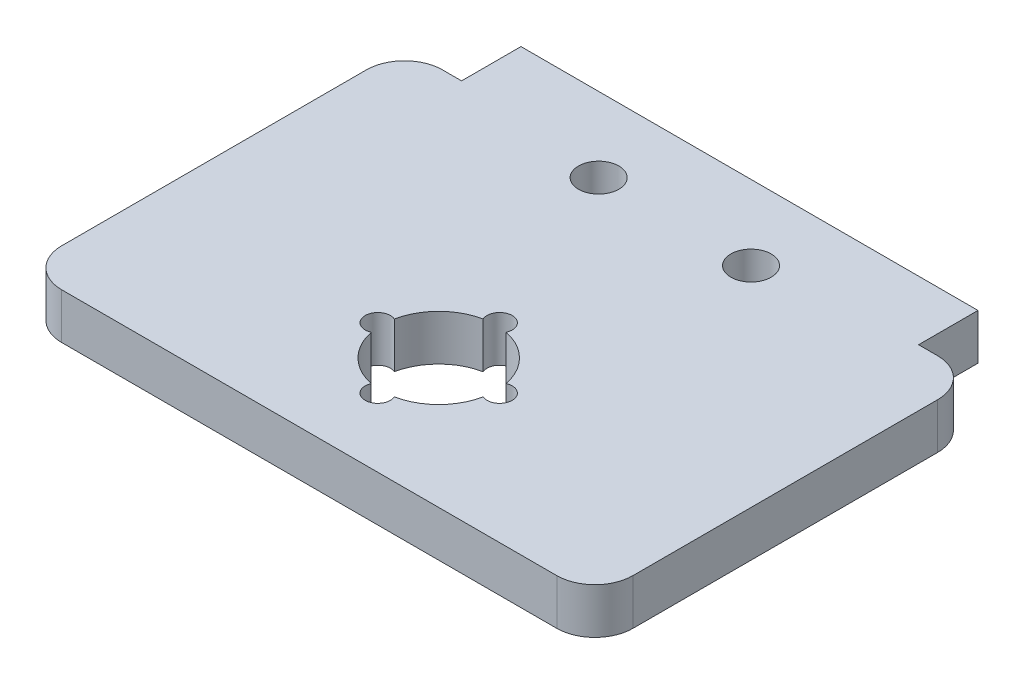
ISO-10303-21;
HEADER;
FILE_DESCRIPTION(('STEP AP214'),'2;1');
FILE_NAME('part.step','',(''),(''),'','','');
FILE_SCHEMA(('AUTOMOTIVE_DESIGN { 1 0 10303 214 1 1 1 1 }'));
ENDSEC;
DATA;
#1=APPLICATION_CONTEXT('core data for automotive mechanical design processes');
#2=APPLICATION_PROTOCOL_DEFINITION('international standard','automotive_design',2000,#1);
#3=PRODUCT_CONTEXT('',#1,'mechanical');
#4=PRODUCT('Part','Part','',(#3));
#5=PRODUCT_RELATED_PRODUCT_CATEGORY('part','',(#4));
#6=PRODUCT_DEFINITION_FORMATION('','',#4);
#7=PRODUCT_DEFINITION_CONTEXT('part definition',#1,'design');
#8=PRODUCT_DEFINITION('design','',#6,#7);
#9=PRODUCT_DEFINITION_SHAPE('','',#8);
#10=(LENGTH_UNIT() NAMED_UNIT(*) SI_UNIT(.MILLI.,.METRE.));
#11=(NAMED_UNIT(*) PLANE_ANGLE_UNIT() SI_UNIT($,.RADIAN.));
#12=(NAMED_UNIT(*) SI_UNIT($,.STERADIAN.) SOLID_ANGLE_UNIT());
#13=UNCERTAINTY_MEASURE_WITH_UNIT(LENGTH_MEASURE(1.E-05),#10,'distance_accuracy_value','');
#14=(GEOMETRIC_REPRESENTATION_CONTEXT(3) GLOBAL_UNCERTAINTY_ASSIGNED_CONTEXT((#13)) GLOBAL_UNIT_ASSIGNED_CONTEXT((#10,
#11,#12)) REPRESENTATION_CONTEXT('',''));
#15=CARTESIAN_POINT('',(0.,0.,0.));
#16=DIRECTION('',(0.,0.,1.));
#17=DIRECTION('',(1.,0.,0.));
#18=AXIS2_PLACEMENT_3D('',#15,#16,#17);
#19=CARTESIAN_POINT('',(-8.,6.,0.));
#20=DIRECTION('',(0.,-1.,0.));
#21=DIRECTION('',(0.,0.,-1.));
#22=AXIS2_PLACEMENT_3D('',#19,#20,#21);
#23=CYLINDRICAL_SURFACE('',#22,1.65);
#24=CARTESIAN_POINT('',(-8.,0.,0.));
#25=DIRECTION('',(0.,1.,0.));
#26=DIRECTION('',(0.,0.,1.));
#27=AXIS2_PLACEMENT_3D('',#24,#25,#26);
#28=CIRCLE('',#27,1.65);
#29=CARTESIAN_POINT('',(-7.34546875,0.,-1.51462498420349));
#30=VERTEX_POINT('',#29);
#31=CARTESIAN_POINT('',(-7.34546875,0.,1.51462498420349));
#32=VERTEX_POINT('',#31);
#33=EDGE_CURVE('E247',#30,#32,#28,.T.);
#34=ORIENTED_EDGE('',*,*,#33,.F.);
#35=DIRECTION('',(0.,-1.,0.));
#36=VECTOR('',#35,1.);
#37=CARTESIAN_POINT('',(-7.34546875,6.,-1.51462498420349));
#38=LINE('',#37,#36);
#39=CARTESIAN_POINT('',(-7.34546875,6.,-1.51462498420349));
#40=VERTEX_POINT('',#39);
#41=EDGE_CURVE('E45',#40,#30,#38,.T.);
#42=ORIENTED_EDGE('',*,*,#41,.F.);
#43=CARTESIAN_POINT('',(-8.,6.,0.));
#44=DIRECTION('',(0.,1.,0.));
#45=DIRECTION('',(0.,0.,1.));
#46=AXIS2_PLACEMENT_3D('',#43,#44,#45);
#47=CIRCLE('',#46,1.65);
#48=CARTESIAN_POINT('',(-7.34546875,6.,1.51462498420349));
#49=VERTEX_POINT('',#48);
#50=EDGE_CURVE('E347',#40,#49,#47,.T.);
#51=ORIENTED_EDGE('',*,*,#50,.T.);
#52=DIRECTION('',(0.,-1.,0.));
#53=VECTOR('',#52,1.);
#54=CARTESIAN_POINT('',(-7.34546875,6.,1.51462498420349));
#55=LINE('',#54,#53);
#56=EDGE_CURVE('E60',#49,#32,#55,.T.);
#57=ORIENTED_EDGE('',*,*,#56,.T.);
#58=EDGE_LOOP('',(#34,#42,#51,#57));
#59=FACE_BOUND('',#58,.T.);
#60=ADVANCED_FACE('F37',(#59),#23,.F.);
#61=CARTESIAN_POINT('',(0.,6.,0.));
#62=DIRECTION('',(0.,-1.,0.));
#63=DIRECTION('',(0.,0.,-1.));
#64=AXIS2_PLACEMENT_3D('',#61,#62,#63);
#65=CYLINDRICAL_SURFACE('',#64,7.5);
#66=CARTESIAN_POINT('',(0.,0.,0.));
#67=DIRECTION('',(0.,1.,0.));
#68=DIRECTION('',(0.,0.,1.));
#69=AXIS2_PLACEMENT_3D('',#66,#67,#68);
#70=CIRCLE('',#69,7.5);
#71=CARTESIAN_POINT('',(-1.51462498420349,0.,-7.34546875));
#72=VERTEX_POINT('',#71);
#73=EDGE_CURVE('E249',#72,#30,#70,.T.);
#74=ORIENTED_EDGE('',*,*,#73,.F.);
#75=DIRECTION('',(0.,-1.,0.));
#76=VECTOR('',#75,1.);
#77=CARTESIAN_POINT('',(-1.51462498420349,6.,-7.34546875));
#78=LINE('',#77,#76);
#79=CARTESIAN_POINT('',(-1.51462498420349,6.,-7.34546875));
#80=VERTEX_POINT('',#79);
#81=EDGE_CURVE('E274',#80,#72,#78,.T.);
#82=ORIENTED_EDGE('',*,*,#81,.F.);
#83=CARTESIAN_POINT('',(0.,6.,0.));
#84=DIRECTION('',(0.,1.,0.));
#85=DIRECTION('',(0.,0.,1.));
#86=AXIS2_PLACEMENT_3D('',#83,#84,#85);
#87=CIRCLE('',#86,7.5);
#88=EDGE_CURVE('E208',#80,#40,#87,.T.);
#89=ORIENTED_EDGE('',*,*,#88,.T.);
#90=ORIENTED_EDGE('',*,*,#41,.T.);
#91=EDGE_LOOP('',(#74,#82,#89,#90));
#92=FACE_BOUND('',#91,.T.);
#93=ADVANCED_FACE('F367',(#92),#65,.F.);
#94=CARTESIAN_POINT('',(0.,6.,-8.));
#95=DIRECTION('',(0.,-1.,0.));
#96=DIRECTION('',(0.,0.,-1.));
#97=AXIS2_PLACEMENT_3D('',#94,#95,#96);
#98=CYLINDRICAL_SURFACE('',#97,1.65);
#99=CARTESIAN_POINT('',(0.,0.,-8.));
#100=DIRECTION('',(0.,1.,0.));
#101=DIRECTION('',(0.,0.,1.));
#102=AXIS2_PLACEMENT_3D('',#99,#100,#101);
#103=CIRCLE('',#102,1.65);
#104=CARTESIAN_POINT('',(1.51462498420349,0.,-7.34546875));
#105=VERTEX_POINT('',#104);
#106=EDGE_CURVE('E252',#105,#72,#103,.T.);
#107=ORIENTED_EDGE('',*,*,#106,.F.);
#108=DIRECTION('',(0.,-1.,0.));
#109=VECTOR('',#108,1.);
#110=CARTESIAN_POINT('',(1.51462498420349,6.,-7.34546875));
#111=LINE('',#110,#109);
#112=CARTESIAN_POINT('',(1.51462498420349,6.,-7.34546875));
#113=VERTEX_POINT('',#112);
#114=EDGE_CURVE('E272',#113,#105,#111,.T.);
#115=ORIENTED_EDGE('',*,*,#114,.F.);
#116=CARTESIAN_POINT('',(0.,6.,-8.));
#117=DIRECTION('',(0.,1.,0.));
#118=DIRECTION('',(0.,0.,1.));
#119=AXIS2_PLACEMENT_3D('',#116,#117,#118);
#120=CIRCLE('',#119,1.65);
#121=EDGE_CURVE('E349',#113,#80,#120,.T.);
#122=ORIENTED_EDGE('',*,*,#121,.T.);
#123=ORIENTED_EDGE('',*,*,#81,.T.);
#124=EDGE_LOOP('',(#107,#115,#122,#123));
#125=FACE_BOUND('',#124,.T.);
#126=ADVANCED_FACE('F369',(#125),#98,.F.);
#127=CARTESIAN_POINT('',(7.34546875,0.,-1.5146249842035));
#128=VERTEX_POINT('',#127);
#129=EDGE_CURVE('E254',#128,#105,#70,.T.);
#130=ORIENTED_EDGE('',*,*,#129,.F.);
#131=DIRECTION('',(0.,-1.,0.));
#132=VECTOR('',#131,1.);
#133=CARTESIAN_POINT('',(7.34546875,6.,-1.5146249842035));
#134=LINE('',#133,#132);
#135=CARTESIAN_POINT('',(7.34546875,6.,-1.5146249842035));
#136=VERTEX_POINT('',#135);
#137=EDGE_CURVE('E270',#136,#128,#134,.T.);
#138=ORIENTED_EDGE('',*,*,#137,.F.);
#139=EDGE_CURVE('E203',#136,#113,#87,.T.);
#140=ORIENTED_EDGE('',*,*,#139,.T.);
#141=ORIENTED_EDGE('',*,*,#114,.T.);
#142=EDGE_LOOP('',(#130,#138,#140,#141));
#143=FACE_BOUND('',#142,.T.);
#144=ADVANCED_FACE('F370',(#143),#65,.F.);
#145=CARTESIAN_POINT('',(8.,6.,0.));
#146=DIRECTION('',(0.,-1.,0.));
#147=DIRECTION('',(0.,0.,-1.));
#148=AXIS2_PLACEMENT_3D('',#145,#146,#147);
#149=CYLINDRICAL_SURFACE('',#148,1.65);
#150=CARTESIAN_POINT('',(8.,0.,0.));
#151=DIRECTION('',(0.,1.,0.));
#152=DIRECTION('',(0.,0.,1.));
#153=AXIS2_PLACEMENT_3D('',#150,#151,#152);
#154=CIRCLE('',#153,1.65);
#155=CARTESIAN_POINT('',(7.34546875,0.,1.5146249842035));
#156=VERTEX_POINT('',#155);
#157=EDGE_CURVE('E257',#156,#128,#154,.T.);
#158=ORIENTED_EDGE('',*,*,#157,.F.);
#159=DIRECTION('',(0.,-1.,0.));
#160=VECTOR('',#159,1.);
#161=CARTESIAN_POINT('',(7.34546875,6.,1.5146249842035));
#162=LINE('',#161,#160);
#163=CARTESIAN_POINT('',(7.34546875,6.,1.5146249842035));
#164=VERTEX_POINT('',#163);
#165=EDGE_CURVE('E188',#164,#156,#162,.T.);
#166=ORIENTED_EDGE('',*,*,#165,.F.);
#167=CARTESIAN_POINT('',(8.,6.,0.));
#168=DIRECTION('',(0.,1.,0.));
#169=DIRECTION('',(0.,0.,1.));
#170=AXIS2_PLACEMENT_3D('',#167,#168,#169);
#171=CIRCLE('',#170,1.65);
#172=EDGE_CURVE('E201',#164,#136,#171,.T.);
#173=ORIENTED_EDGE('',*,*,#172,.T.);
#174=ORIENTED_EDGE('',*,*,#137,.T.);
#175=EDGE_LOOP('',(#158,#166,#173,#174));
#176=FACE_BOUND('',#175,.T.);
#177=ADVANCED_FACE('F357',(#176),#149,.F.);
#178=CARTESIAN_POINT('',(1.5146249842035,0.,7.34546875));
#179=VERTEX_POINT('',#178);
#180=EDGE_CURVE('E183',#179,#156,#70,.T.);
#181=ORIENTED_EDGE('',*,*,#180,.F.);
#182=DIRECTION('',(0.,-1.,0.));
#183=VECTOR('',#182,1.);
#184=CARTESIAN_POINT('',(1.5146249842035,6.,7.34546875));
#185=LINE('',#184,#183);
#186=CARTESIAN_POINT('',(1.5146249842035,6.,7.34546875));
#187=VERTEX_POINT('',#186);
#188=EDGE_CURVE('E178',#187,#179,#185,.T.);
#189=ORIENTED_EDGE('',*,*,#188,.F.);
#190=EDGE_CURVE('E181',#187,#164,#87,.T.);
#191=ORIENTED_EDGE('',*,*,#190,.T.);
#192=ORIENTED_EDGE('',*,*,#165,.T.);
#193=EDGE_LOOP('',(#181,#189,#191,#192));
#194=FACE_BOUND('',#193,.T.);
#195=ADVANCED_FACE('F180',(#194),#65,.F.);
#196=CARTESIAN_POINT('',(0.,6.,8.));
#197=DIRECTION('',(0.,-1.,0.));
#198=DIRECTION('',(0.,0.,-1.));
#199=AXIS2_PLACEMENT_3D('',#196,#197,#198);
#200=CYLINDRICAL_SURFACE('',#199,1.65);
#201=CARTESIAN_POINT('',(0.,0.,8.));
#202=DIRECTION('',(0.,1.,0.));
#203=DIRECTION('',(0.,0.,1.));
#204=AXIS2_PLACEMENT_3D('',#201,#202,#203);
#205=CIRCLE('',#204,1.65);
#206=CARTESIAN_POINT('',(-1.5146249842035,0.,7.34546875));
#207=VERTEX_POINT('',#206);
#208=EDGE_CURVE('E260',#207,#179,#205,.T.);
#209=ORIENTED_EDGE('',*,*,#208,.F.);
#210=DIRECTION('',(0.,-1.,0.));
#211=VECTOR('',#210,1.);
#212=CARTESIAN_POINT('',(-1.5146249842035,6.,7.34546875));
#213=LINE('',#212,#211);
#214=CARTESIAN_POINT('',(-1.5146249842035,6.,7.34546875));
#215=VERTEX_POINT('',#214);
#216=EDGE_CURVE('E189',#215,#207,#213,.T.);
#217=ORIENTED_EDGE('',*,*,#216,.F.);
#218=CARTESIAN_POINT('',(0.,6.,8.));
#219=DIRECTION('',(0.,1.,0.));
#220=DIRECTION('',(0.,0.,1.));
#221=AXIS2_PLACEMENT_3D('',#218,#219,#220);
#222=CIRCLE('',#221,1.65);
#223=EDGE_CURVE('E198',#215,#187,#222,.T.);
#224=ORIENTED_EDGE('',*,*,#223,.T.);
#225=ORIENTED_EDGE('',*,*,#188,.T.);
#226=EDGE_LOOP('',(#209,#217,#224,#225));
#227=FACE_BOUND('',#226,.T.);
#228=ADVANCED_FACE('F205',(#227),#200,.F.);
#229=CARTESIAN_POINT('',(-37.5,6.,0.));
#230=DIRECTION('',(1.,0.,0.));
#231=DIRECTION('',(0.,0.,-1.));
#232=AXIS2_PLACEMENT_3D('',#229,#230,#231);
#233=PLANE('',#232);
#234=DIRECTION('',(0.,0.,1.));
#235=VECTOR('',#234,1.);
#236=CARTESIAN_POINT('',(-37.5,0.,0.));
#237=LINE('',#236,#235);
#238=CARTESIAN_POINT('',(-37.5,0.,-28.));
#239=VERTEX_POINT('',#238);
#240=CARTESIAN_POINT('',(-37.5,0.,12.));
#241=VERTEX_POINT('',#240);
#242=EDGE_CURVE('E215',#239,#241,#237,.T.);
#243=ORIENTED_EDGE('',*,*,#242,.T.);
#244=DIRECTION('',(0.,-1.,0.));
#245=VECTOR('',#244,1.);
#246=CARTESIAN_POINT('',(-37.5,6.,12.));
#247=LINE('',#246,#245);
#248=CARTESIAN_POINT('',(-37.5,6.,12.));
#249=VERTEX_POINT('',#248);
#250=EDGE_CURVE('E267',#249,#241,#247,.T.);
#251=ORIENTED_EDGE('',*,*,#250,.F.);
#252=DIRECTION('',(0.,0.,1.));
#253=VECTOR('',#252,1.);
#254=CARTESIAN_POINT('',(-37.5,6.,0.));
#255=LINE('',#254,#253);
#256=CARTESIAN_POINT('',(-37.5,6.,-28.));
#257=VERTEX_POINT('',#256);
#258=EDGE_CURVE('E265',#257,#249,#255,.T.);
#259=ORIENTED_EDGE('',*,*,#258,.F.);
#260=DIRECTION('',(0.,-1.,0.));
#261=VECTOR('',#260,1.);
#262=CARTESIAN_POINT('',(-37.5,6.,-28.));
#263=LINE('',#262,#261);
#264=EDGE_CURVE('E214',#257,#239,#263,.T.);
#265=ORIENTED_EDGE('',*,*,#264,.T.);
#266=EDGE_LOOP('',(#243,#251,#259,#265));
#267=FACE_BOUND('',#266,.T.);
#268=ADVANCED_FACE('F39',(#267),#233,.F.);
#269=CARTESIAN_POINT('',(-32.5,6.,12.));
#270=DIRECTION('',(0.,-1.,0.));
#271=DIRECTION('',(0.,0.,-1.));
#272=AXIS2_PLACEMENT_3D('',#269,#270,#271);
#273=CYLINDRICAL_SURFACE('',#272,5.);
#274=CARTESIAN_POINT('',(-32.5,0.,12.));
#275=DIRECTION('',(0.,1.,0.));
#276=DIRECTION('',(0.,0.,1.));
#277=AXIS2_PLACEMENT_3D('',#274,#275,#276);
#278=CIRCLE('',#277,5.);
#279=CARTESIAN_POINT('',(-32.5,0.,17.));
#280=VERTEX_POINT('',#279);
#281=EDGE_CURVE('E218',#241,#280,#278,.T.);
#282=ORIENTED_EDGE('',*,*,#281,.T.);
#283=DIRECTION('',(0.,-1.,0.));
#284=VECTOR('',#283,1.);
#285=CARTESIAN_POINT('',(-32.5,6.,17.));
#286=LINE('',#285,#284);
#287=CARTESIAN_POINT('',(-32.5,6.,17.));
#288=VERTEX_POINT('',#287);
#289=EDGE_CURVE('E295',#288,#280,#286,.T.);
#290=ORIENTED_EDGE('',*,*,#289,.F.);
#291=CARTESIAN_POINT('',(-32.5,6.,12.));
#292=DIRECTION('',(0.,1.,0.));
#293=DIRECTION('',(0.,0.,1.));
#294=AXIS2_PLACEMENT_3D('',#291,#292,#293);
#295=CIRCLE('',#294,5.);
#296=EDGE_CURVE('E130',#249,#288,#295,.T.);
#297=ORIENTED_EDGE('',*,*,#296,.F.);
#298=ORIENTED_EDGE('',*,*,#250,.T.);
#299=EDGE_LOOP('',(#282,#290,#297,#298));
#300=FACE_BOUND('',#299,.T.);
#301=ADVANCED_FACE('F298',(#300),#273,.T.);
#302=CARTESIAN_POINT('',(0.,6.,17.));
#303=DIRECTION('',(0.,0.,-1.));
#304=DIRECTION('',(-1.,0.,0.));
#305=AXIS2_PLACEMENT_3D('',#302,#303,#304);
#306=PLANE('',#305);
#307=DIRECTION('',(1.,0.,0.));
#308=VECTOR('',#307,1.);
#309=CARTESIAN_POINT('',(0.,0.,17.));
#310=LINE('',#309,#308);
#311=CARTESIAN_POINT('',(32.5,0.,17.));
#312=VERTEX_POINT('',#311);
#313=EDGE_CURVE('E220',#280,#312,#310,.T.);
#314=ORIENTED_EDGE('',*,*,#313,.T.);
#315=DIRECTION('',(0.,-1.,0.));
#316=VECTOR('',#315,1.);
#317=CARTESIAN_POINT('',(32.5,6.,17.));
#318=LINE('',#317,#316);
#319=CARTESIAN_POINT('',(32.5,6.,17.));
#320=VERTEX_POINT('',#319);
#321=EDGE_CURVE('E292',#320,#312,#318,.T.);
#322=ORIENTED_EDGE('',*,*,#321,.F.);
#323=DIRECTION('',(1.,0.,0.));
#324=VECTOR('',#323,1.);
#325=CARTESIAN_POINT('',(0.,6.,17.));
#326=LINE('',#325,#324);
#327=EDGE_CURVE('E323',#288,#320,#326,.T.);
#328=ORIENTED_EDGE('',*,*,#327,.F.);
#329=ORIENTED_EDGE('',*,*,#289,.T.);
#330=EDGE_LOOP('',(#314,#322,#328,#329));
#331=FACE_BOUND('',#330,.T.);
#332=ADVANCED_FACE('F312',(#331),#306,.F.);
#333=CARTESIAN_POINT('',(32.5,6.,12.));
#334=DIRECTION('',(0.,-1.,0.));
#335=DIRECTION('',(0.,0.,-1.));
#336=AXIS2_PLACEMENT_3D('',#333,#334,#335);
#337=CYLINDRICAL_SURFACE('',#336,5.);
#338=CARTESIAN_POINT('',(32.5,0.,12.));
#339=DIRECTION('',(0.,1.,0.));
#340=DIRECTION('',(0.,0.,1.));
#341=AXIS2_PLACEMENT_3D('',#338,#339,#340);
#342=CIRCLE('',#341,5.);
#343=CARTESIAN_POINT('',(37.5,0.,12.));
#344=VERTEX_POINT('',#343);
#345=EDGE_CURVE('E222',#312,#344,#342,.T.);
#346=ORIENTED_EDGE('',*,*,#345,.T.);
#347=DIRECTION('',(0.,-1.,0.));
#348=VECTOR('',#347,1.);
#349=CARTESIAN_POINT('',(37.5,6.,12.));
#350=LINE('',#349,#348);
#351=CARTESIAN_POINT('',(37.5,6.,12.));
#352=VERTEX_POINT('',#351);
#353=EDGE_CURVE('E290',#352,#344,#350,.T.);
#354=ORIENTED_EDGE('',*,*,#353,.F.);
#355=CARTESIAN_POINT('',(32.5,6.,12.));
#356=DIRECTION('',(0.,1.,0.));
#357=DIRECTION('',(0.,0.,1.));
#358=AXIS2_PLACEMENT_3D('',#355,#356,#357);
#359=CIRCLE('',#358,5.);
#360=EDGE_CURVE('E318',#320,#352,#359,.T.);
#361=ORIENTED_EDGE('',*,*,#360,.F.);
#362=ORIENTED_EDGE('',*,*,#321,.T.);
#363=EDGE_LOOP('',(#346,#354,#361,#362));
#364=FACE_BOUND('',#363,.T.);
#365=ADVANCED_FACE('F316',(#364),#337,.T.);
#366=CARTESIAN_POINT('',(37.5,6.,0.));
#367=DIRECTION('',(1.,0.,0.));
#368=DIRECTION('',(0.,0.,-1.));
#369=AXIS2_PLACEMENT_3D('',#366,#367,#368);
#370=PLANE('',#369);
#371=DIRECTION('',(0.,0.,1.));
#372=VECTOR('',#371,1.);
#373=CARTESIAN_POINT('',(37.5,0.,0.));
#374=LINE('',#373,#372);
#375=CARTESIAN_POINT('',(37.5,0.,-28.));
#376=VERTEX_POINT('',#375);
#377=EDGE_CURVE('E225',#376,#344,#374,.T.);
#378=ORIENTED_EDGE('',*,*,#377,.F.);
#379=DIRECTION('',(0.,-1.,0.));
#380=VECTOR('',#379,1.);
#381=CARTESIAN_POINT('',(37.5,6.,-28.));
#382=LINE('',#381,#380);
#383=CARTESIAN_POINT('',(37.5,6.,-28.));
#384=VERTEX_POINT('',#383);
#385=EDGE_CURVE('E288',#384,#376,#382,.T.);
#386=ORIENTED_EDGE('',*,*,#385,.F.);
#387=DIRECTION('',(0.,0.,1.));
#388=VECTOR('',#387,1.);
#389=CARTESIAN_POINT('',(37.5,6.,0.));
#390=LINE('',#389,#388);
#391=EDGE_CURVE('E322',#384,#352,#390,.T.);
#392=ORIENTED_EDGE('',*,*,#391,.T.);
#393=ORIENTED_EDGE('',*,*,#353,.T.);
#394=EDGE_LOOP('',(#378,#386,#392,#393));
#395=FACE_BOUND('',#394,.T.);
#396=ADVANCED_FACE('F416',(#395),#370,.T.);
#397=CARTESIAN_POINT('',(32.5,6.,-28.));
#398=DIRECTION('',(0.,-1.,0.));
#399=DIRECTION('',(0.,0.,-1.));
#400=AXIS2_PLACEMENT_3D('',#397,#398,#399);
#401=CYLINDRICAL_SURFACE('',#400,5.);
#402=CARTESIAN_POINT('',(32.5,0.,-28.));
#403=DIRECTION('',(0.,1.,0.));
#404=DIRECTION('',(0.,0.,1.));
#405=AXIS2_PLACEMENT_3D('',#402,#403,#404);
#406=CIRCLE('',#405,5.);
#407=CARTESIAN_POINT('',(32.5,0.,-33.));
#408=VERTEX_POINT('',#407);
#409=EDGE_CURVE('E228',#376,#408,#406,.T.);
#410=ORIENTED_EDGE('',*,*,#409,.T.);
#411=DIRECTION('',(0.,-1.,0.));
#412=VECTOR('',#411,1.);
#413=CARTESIAN_POINT('',(32.5,6.,-33.));
#414=LINE('',#413,#412);
#415=CARTESIAN_POINT('',(32.5,6.,-33.));
#416=VERTEX_POINT('',#415);
#417=EDGE_CURVE('E286',#416,#408,#414,.T.);
#418=ORIENTED_EDGE('',*,*,#417,.F.);
#419=CARTESIAN_POINT('',(32.5,6.,-28.));
#420=DIRECTION('',(0.,1.,0.));
#421=DIRECTION('',(0.,0.,1.));
#422=AXIS2_PLACEMENT_3D('',#419,#420,#421);
#423=CIRCLE('',#422,5.);
#424=EDGE_CURVE('E325',#384,#416,#423,.T.);
#425=ORIENTED_EDGE('',*,*,#424,.F.);
#426=ORIENTED_EDGE('',*,*,#385,.T.);
#427=EDGE_LOOP('',(#410,#418,#425,#426));
#428=FACE_BOUND('',#427,.T.);
#429=ADVANCED_FACE('F412',(#428),#401,.T.);
#430=CARTESIAN_POINT('',(0.,6.,-33.));
#431=DIRECTION('',(0.,0.,-1.));
#432=DIRECTION('',(-1.,0.,0.));
#433=AXIS2_PLACEMENT_3D('',#430,#431,#432);
#434=PLANE('',#433);
#435=DIRECTION('',(1.,0.,0.));
#436=VECTOR('',#435,1.);
#437=CARTESIAN_POINT('',(0.,0.,-33.));
#438=LINE('',#437,#436);
#439=CARTESIAN_POINT('',(30.,0.,-33.));
#440=VERTEX_POINT('',#439);
#441=EDGE_CURVE('E231',#440,#408,#438,.T.);
#442=ORIENTED_EDGE('',*,*,#441,.F.);
#443=DIRECTION('',(0.,-1.,0.));
#444=VECTOR('',#443,1.);
#445=CARTESIAN_POINT('',(30.,6.,-33.));
#446=LINE('',#445,#444);
#447=CARTESIAN_POINT('',(30.,6.,-33.));
#448=VERTEX_POINT('',#447);
#449=EDGE_CURVE('E283',#448,#440,#446,.T.);
#450=ORIENTED_EDGE('',*,*,#449,.F.);
#451=DIRECTION('',(1.,0.,0.));
#452=VECTOR('',#451,1.);
#453=CARTESIAN_POINT('',(0.,6.,-33.));
#454=LINE('',#453,#452);
#455=EDGE_CURVE('E331',#448,#416,#454,.T.);
#456=ORIENTED_EDGE('',*,*,#455,.T.);
#457=ORIENTED_EDGE('',*,*,#417,.T.);
#458=EDGE_LOOP('',(#442,#450,#456,#457));
#459=FACE_BOUND('',#458,.T.);
#460=ADVANCED_FACE('F408',(#459),#434,.T.);
#461=CARTESIAN_POINT('',(30.,6.,0.));
#462=DIRECTION('',(1.,0.,0.));
#463=DIRECTION('',(0.,0.,-1.));
#464=AXIS2_PLACEMENT_3D('',#461,#462,#463);
#465=PLANE('',#464);
#466=DIRECTION('',(0.,1.,0.));
#467=VECTOR('',#466,1.);
#468=CARTESIAN_POINT('',(30.,-4.,-40.8002328593656));
#469=LINE('',#468,#467);
#470=CARTESIAN_POINT('',(30.,0.,-40.8002328593656));
#471=VERTEX_POINT('',#470);
#472=CARTESIAN_POINT('',(30.,6.,-40.8002328593656));
#473=VERTEX_POINT('',#472);
#474=EDGE_CURVE('E52',#471,#473,#469,.T.);
#475=ORIENTED_EDGE('',*,*,#474,.T.);
#476=DIRECTION('',(0.,0.,1.));
#477=VECTOR('',#476,1.);
#478=CARTESIAN_POINT('',(30.,6.,0.));
#479=LINE('',#478,#477);
#480=EDGE_CURVE('E334',#473,#448,#479,.T.);
#481=ORIENTED_EDGE('',*,*,#480,.T.);
#482=ORIENTED_EDGE('',*,*,#449,.T.);
#483=DIRECTION('',(0.,0.,1.));
#484=VECTOR('',#483,1.);
#485=CARTESIAN_POINT('',(30.,0.,0.));
#486=LINE('',#485,#484);
#487=EDGE_CURVE('E234',#471,#440,#486,.T.);
#488=ORIENTED_EDGE('',*,*,#487,.F.);
#489=EDGE_LOOP('',(#475,#481,#482,#488));
#490=FACE_BOUND('',#489,.T.);
#491=ADVANCED_FACE('F404',(#490),#465,.T.);
#492=CARTESIAN_POINT('',(-30.,6.,0.));
#493=DIRECTION('',(-1.,0.,0.));
#494=DIRECTION('',(0.,0.,1.));
#495=AXIS2_PLACEMENT_3D('',#492,#493,#494);
#496=PLANE('',#495);
#497=DIRECTION('',(0.,1.,0.));
#498=VECTOR('',#497,1.);
#499=CARTESIAN_POINT('',(-30.,-4.,-40.8002328593656));
#500=LINE('',#499,#498);
#501=CARTESIAN_POINT('',(-30.,0.,-40.8002328593656));
#502=VERTEX_POINT('',#501);
#503=CARTESIAN_POINT('',(-30.,6.,-40.8002328593656));
#504=VERTEX_POINT('',#503);
#505=EDGE_CURVE('E570',#502,#504,#500,.T.);
#506=ORIENTED_EDGE('',*,*,#505,.F.);
#507=DIRECTION('',(0.,0.,-1.));
#508=VECTOR('',#507,1.);
#509=CARTESIAN_POINT('',(-30.,0.,0.));
#510=LINE('',#509,#508);
#511=CARTESIAN_POINT('',(-30.,0.,-33.));
#512=VERTEX_POINT('',#511);
#513=EDGE_CURVE('E236',#512,#502,#510,.T.);
#514=ORIENTED_EDGE('',*,*,#513,.F.);
#515=DIRECTION('',(0.,-1.,0.));
#516=VECTOR('',#515,1.);
#517=CARTESIAN_POINT('',(-30.,6.,-33.));
#518=LINE('',#517,#516);
#519=CARTESIAN_POINT('',(-30.,6.,-33.));
#520=VERTEX_POINT('',#519);
#521=EDGE_CURVE('E281',#520,#512,#518,.T.);
#522=ORIENTED_EDGE('',*,*,#521,.F.);
#523=DIRECTION('',(0.,0.,-1.));
#524=VECTOR('',#523,1.);
#525=CARTESIAN_POINT('',(-30.,6.,0.));
#526=LINE('',#525,#524);
#527=EDGE_CURVE('E336',#520,#504,#526,.T.);
#528=ORIENTED_EDGE('',*,*,#527,.T.);
#529=EDGE_LOOP('',(#506,#514,#522,#528));
#530=FACE_BOUND('',#529,.T.);
#531=ADVANCED_FACE('F400',(#530),#496,.T.);
#532=CARTESIAN_POINT('',(0.,6.,-33.));
#533=DIRECTION('',(0.,0.,-1.));
#534=DIRECTION('',(-1.,0.,0.));
#535=AXIS2_PLACEMENT_3D('',#532,#533,#534);
#536=PLANE('',#535);
#537=DIRECTION('',(1.,0.,0.));
#538=VECTOR('',#537,1.);
#539=CARTESIAN_POINT('',(0.,0.,-33.));
#540=LINE('',#539,#538);
#541=CARTESIAN_POINT('',(-32.5,0.,-33.));
#542=VERTEX_POINT('',#541);
#543=EDGE_CURVE('E239',#542,#512,#540,.T.);
#544=ORIENTED_EDGE('',*,*,#543,.F.);
#545=DIRECTION('',(0.,-1.,0.));
#546=VECTOR('',#545,1.);
#547=CARTESIAN_POINT('',(-32.5,6.,-33.));
#548=LINE('',#547,#546);
#549=CARTESIAN_POINT('',(-32.5,6.,-33.));
#550=VERTEX_POINT('',#549);
#551=EDGE_CURVE('E279',#550,#542,#548,.T.);
#552=ORIENTED_EDGE('',*,*,#551,.F.);
#553=DIRECTION('',(1.,0.,0.));
#554=VECTOR('',#553,1.);
#555=CARTESIAN_POINT('',(0.,6.,-33.));
#556=LINE('',#555,#554);
#557=EDGE_CURVE('E339',#550,#520,#556,.T.);
#558=ORIENTED_EDGE('',*,*,#557,.T.);
#559=ORIENTED_EDGE('',*,*,#521,.T.);
#560=EDGE_LOOP('',(#544,#552,#558,#559));
#561=FACE_BOUND('',#560,.T.);
#562=ADVANCED_FACE('F397',(#561),#536,.T.);
#563=EDGE_CURVE('E253',#32,#207,#70,.T.);
#564=ORIENTED_EDGE('',*,*,#563,.F.);
#565=ORIENTED_EDGE('',*,*,#56,.F.);
#566=EDGE_CURVE('E204',#49,#215,#87,.T.);
#567=ORIENTED_EDGE('',*,*,#566,.T.);
#568=ORIENTED_EDGE('',*,*,#216,.T.);
#569=EDGE_LOOP('',(#564,#565,#567,#568));
#570=FACE_BOUND('',#569,.T.);
#571=ADVANCED_FACE('F363',(#570),#65,.F.);
#572=CARTESIAN_POINT('',(-9.99999999999999,6.,-31.));
#573=DIRECTION('',(0.,-1.,0.));
#574=DIRECTION('',(0.,0.,-1.));
#575=AXIS2_PLACEMENT_3D('',#572,#573,#574);
#576=CYLINDRICAL_SURFACE('',#575,2.65);
#577=CARTESIAN_POINT('',(-9.99999999999999,6.,-31.));
#578=DIRECTION('',(0.,1.,0.));
#579=DIRECTION('',(0.,0.,1.));
#580=AXIS2_PLACEMENT_3D('',#577,#578,#579);
#581=CIRCLE('',#580,2.65);
#582=CARTESIAN_POINT('',(-9.99999999999999,6.,-28.35));
#583=VERTEX_POINT('',#582);
#584=EDGE_CURVE('E344',#583,#583,#581,.T.);
#585=ORIENTED_EDGE('',*,*,#584,.T.);
#586=EDGE_LOOP('',(#585));
#587=FACE_BOUND('',#586,.T.);
#588=CARTESIAN_POINT('',(-9.99999999999999,0.,-31.));
#589=DIRECTION('',(0.,1.,0.));
#590=DIRECTION('',(0.,0.,1.));
#591=AXIS2_PLACEMENT_3D('',#588,#589,#590);
#592=CIRCLE('',#591,2.65);
#593=CARTESIAN_POINT('',(-9.99999999999999,0.,-28.35));
#594=VERTEX_POINT('',#593);
#595=EDGE_CURVE('E244',#594,#594,#592,.T.);
#596=ORIENTED_EDGE('',*,*,#595,.F.);
#597=EDGE_LOOP('',(#596));
#598=FACE_BOUND('',#597,.T.);
#599=ADVANCED_FACE('F388',(#587,#598),#576,.F.);
#600=CARTESIAN_POINT('',(-32.5,6.,-28.));
#601=DIRECTION('',(0.,-1.,0.));
#602=DIRECTION('',(0.,0.,-1.));
#603=AXIS2_PLACEMENT_3D('',#600,#601,#602);
#604=CYLINDRICAL_SURFACE('',#603,5.);
#605=CARTESIAN_POINT('',(-32.5,0.,-28.));
#606=DIRECTION('',(0.,1.,0.));
#607=DIRECTION('',(0.,0.,1.));
#608=AXIS2_PLACEMENT_3D('',#605,#606,#607);
#609=CIRCLE('',#608,5.);
#610=EDGE_CURVE('E242',#542,#239,#609,.T.);
#611=ORIENTED_EDGE('',*,*,#610,.T.);
#612=ORIENTED_EDGE('',*,*,#264,.F.);
#613=CARTESIAN_POINT('',(-32.5,6.,-28.));
#614=DIRECTION('',(0.,1.,0.));
#615=DIRECTION('',(0.,0.,1.));
#616=AXIS2_PLACEMENT_3D('',#613,#614,#615);
#617=CIRCLE('',#616,5.);
#618=EDGE_CURVE('E342',#550,#257,#617,.T.);
#619=ORIENTED_EDGE('',*,*,#618,.F.);
#620=ORIENTED_EDGE('',*,*,#551,.T.);
#621=EDGE_LOOP('',(#611,#612,#619,#620));
#622=FACE_BOUND('',#621,.T.);
#623=ADVANCED_FACE('F391',(#622),#604,.T.);
#624=CARTESIAN_POINT('',(10.,6.,-31.));
#625=DIRECTION('',(0.,-1.,0.));
#626=DIRECTION('',(0.,0.,-1.));
#627=AXIS2_PLACEMENT_3D('',#624,#625,#626);
#628=CYLINDRICAL_SURFACE('',#627,2.65);
#629=CARTESIAN_POINT('',(10.,6.,-31.));
#630=DIRECTION('',(0.,1.,0.));
#631=DIRECTION('',(0.,0.,1.));
#632=AXIS2_PLACEMENT_3D('',#629,#630,#631);
#633=CIRCLE('',#632,2.65);
#634=CARTESIAN_POINT('',(10.,6.,-28.35));
#635=VERTEX_POINT('',#634);
#636=EDGE_CURVE('E207',#635,#635,#633,.F.);
#637=ORIENTED_EDGE('',*,*,#636,.F.);
#638=EDGE_LOOP('',(#637));
#639=FACE_BOUND('',#638,.T.);
#640=CARTESIAN_POINT('',(10.,0.,-31.));
#641=DIRECTION('',(0.,1.,0.));
#642=DIRECTION('',(0.,0.,1.));
#643=AXIS2_PLACEMENT_3D('',#640,#641,#642);
#644=CIRCLE('',#643,2.65);
#645=CARTESIAN_POINT('',(10.,0.,-28.35));
#646=VERTEX_POINT('',#645);
#647=EDGE_CURVE('E262',#646,#646,#644,.F.);
#648=ORIENTED_EDGE('',*,*,#647,.T.);
#649=EDGE_LOOP('',(#648));
#650=FACE_BOUND('',#649,.T.);
#651=ADVANCED_FACE('F395',(#639,#650),#628,.F.);
#652=CARTESIAN_POINT('',(0.,6.,0.));
#653=DIRECTION('',(0.,1.,0.));
#654=DIRECTION('',(0.,0.,1.));
#655=AXIS2_PLACEMENT_3D('',#652,#653,#654);
#656=PLANE('',#655);
#657=DIRECTION('',(1.,0.,0.));
#658=VECTOR('',#657,1.);
#659=CARTESIAN_POINT('',(-30.,6.,-40.8002328593656));
#660=LINE('',#659,#658);
#661=EDGE_CURVE('E573',#504,#473,#660,.T.);
#662=ORIENTED_EDGE('',*,*,#661,.F.);
#663=ORIENTED_EDGE('',*,*,#527,.F.);
#664=ORIENTED_EDGE('',*,*,#557,.F.);
#665=ORIENTED_EDGE('',*,*,#618,.T.);
#666=ORIENTED_EDGE('',*,*,#258,.T.);
#667=ORIENTED_EDGE('',*,*,#296,.T.);
#668=ORIENTED_EDGE('',*,*,#327,.T.);
#669=ORIENTED_EDGE('',*,*,#360,.T.);
#670=ORIENTED_EDGE('',*,*,#391,.F.);
#671=ORIENTED_EDGE('',*,*,#424,.T.);
#672=ORIENTED_EDGE('',*,*,#455,.F.);
#673=ORIENTED_EDGE('',*,*,#480,.F.);
#674=EDGE_LOOP('',(#662,#663,#664,#665,#666,#667,#668,#669,#670,#671,#672,#673));
#675=FACE_BOUND('',#674,.T.);
#676=ORIENTED_EDGE('',*,*,#584,.F.);
#677=EDGE_LOOP('',(#676));
#678=FACE_BOUND('',#677,.T.);
#679=ORIENTED_EDGE('',*,*,#50,.F.);
#680=ORIENTED_EDGE('',*,*,#88,.F.);
#681=ORIENTED_EDGE('',*,*,#121,.F.);
#682=ORIENTED_EDGE('',*,*,#139,.F.);
#683=ORIENTED_EDGE('',*,*,#172,.F.);
#684=ORIENTED_EDGE('',*,*,#190,.F.);
#685=ORIENTED_EDGE('',*,*,#223,.F.);
#686=ORIENTED_EDGE('',*,*,#566,.F.);
#687=EDGE_LOOP('',(#679,#680,#681,#682,#683,#684,#685,#686));
#688=FACE_BOUND('',#687,.T.);
#689=ORIENTED_EDGE('',*,*,#636,.T.);
#690=EDGE_LOOP('',(#689));
#691=FACE_BOUND('',#690,.T.);
#692=ADVANCED_FACE('F195',(#675,#678,#688,#691),#656,.T.);
#693=CARTESIAN_POINT('',(0.,0.,0.));
#694=DIRECTION('',(0.,1.,0.));
#695=DIRECTION('',(0.,0.,1.));
#696=AXIS2_PLACEMENT_3D('',#693,#694,#695);
#697=PLANE('',#696);
#698=ORIENTED_EDGE('',*,*,#513,.T.);
#699=DIRECTION('',(1.,0.,0.));
#700=VECTOR('',#699,1.);
#701=CARTESIAN_POINT('',(0.,0.,-40.8002328593656));
#702=LINE('',#701,#700);
#703=EDGE_CURVE('E11',#502,#471,#702,.T.);
#704=ORIENTED_EDGE('',*,*,#703,.T.);
#705=ORIENTED_EDGE('',*,*,#487,.T.);
#706=ORIENTED_EDGE('',*,*,#441,.T.);
#707=ORIENTED_EDGE('',*,*,#409,.F.);
#708=ORIENTED_EDGE('',*,*,#377,.T.);
#709=ORIENTED_EDGE('',*,*,#345,.F.);
#710=ORIENTED_EDGE('',*,*,#313,.F.);
#711=ORIENTED_EDGE('',*,*,#281,.F.);
#712=ORIENTED_EDGE('',*,*,#242,.F.);
#713=ORIENTED_EDGE('',*,*,#610,.F.);
#714=ORIENTED_EDGE('',*,*,#543,.T.);
#715=EDGE_LOOP('',(#698,#704,#705,#706,#707,#708,#709,#710,#711,#712,#713,#714));
#716=FACE_BOUND('',#715,.T.);
#717=ORIENTED_EDGE('',*,*,#595,.T.);
#718=EDGE_LOOP('',(#717));
#719=FACE_BOUND('',#718,.T.);
#720=ORIENTED_EDGE('',*,*,#33,.T.);
#721=ORIENTED_EDGE('',*,*,#563,.T.);
#722=ORIENTED_EDGE('',*,*,#208,.T.);
#723=ORIENTED_EDGE('',*,*,#180,.T.);
#724=ORIENTED_EDGE('',*,*,#157,.T.);
#725=ORIENTED_EDGE('',*,*,#129,.T.);
#726=ORIENTED_EDGE('',*,*,#106,.T.);
#727=ORIENTED_EDGE('',*,*,#73,.T.);
#728=EDGE_LOOP('',(#720,#721,#722,#723,#724,#725,#726,#727));
#729=FACE_BOUND('',#728,.T.);
#730=ORIENTED_EDGE('',*,*,#647,.F.);
#731=EDGE_LOOP('',(#730));
#732=FACE_BOUND('',#731,.T.);
#733=ADVANCED_FACE('F305',(#716,#719,#729,#732),#697,.F.);
#734=CARTESIAN_POINT('',(-30.,-4.,-40.8002328593656));
#735=DIRECTION('',(0.,0.,1.));
#736=DIRECTION('',(1.,0.,0.));
#737=AXIS2_PLACEMENT_3D('',#734,#735,#736);
#738=PLANE('',#737);
#739=ORIENTED_EDGE('',*,*,#505,.T.);
#740=ORIENTED_EDGE('',*,*,#661,.T.);
#741=ORIENTED_EDGE('',*,*,#474,.F.);
#742=ORIENTED_EDGE('',*,*,#703,.F.);
#743=EDGE_LOOP('',(#739,#740,#741,#742));
#744=FACE_BOUND('',#743,.T.);
#745=ADVANCED_FACE('F553',(#744),#738,.F.);
#746=CLOSED_SHELL('',(#60,#93,#126,#144,#177,#195,#228,#268,#301,#332,#365,#396,#429,#460,#491,
#531,#562,#571,#599,#623,#651,#692,#733,#745));
#747=MANIFOLD_SOLID_BREP('B2',#746);
#748=ADVANCED_BREP_SHAPE_REPRESENTATION('',(#18,#747),#14);
#749=SHAPE_DEFINITION_REPRESENTATION(#9,#748);
ENDSEC;
END-ISO-10303-21;
